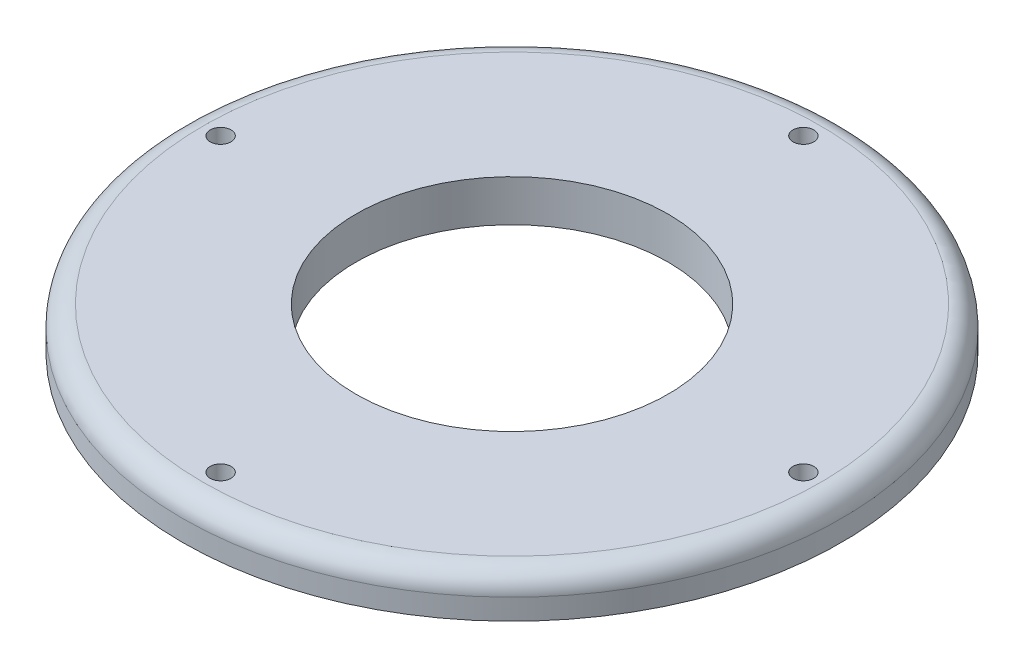
ISO-10303-21;
HEADER;
FILE_DESCRIPTION(('STEP AP214'),'2;1');
FILE_NAME('part.step','',(''),(''),'','','');
FILE_SCHEMA(('AUTOMOTIVE_DESIGN { 1 0 10303 214 1 1 1 1 }'));
ENDSEC;
DATA;
#1=APPLICATION_CONTEXT('core data for automotive mechanical design processes');
#2=APPLICATION_PROTOCOL_DEFINITION('international standard','automotive_design',2000,#1);
#3=PRODUCT_CONTEXT('',#1,'mechanical');
#4=PRODUCT('Part','Part','',(#3));
#5=PRODUCT_RELATED_PRODUCT_CATEGORY('part','',(#4));
#6=PRODUCT_DEFINITION_FORMATION('','',#4);
#7=PRODUCT_DEFINITION_CONTEXT('part definition',#1,'design');
#8=PRODUCT_DEFINITION('design','',#6,#7);
#9=PRODUCT_DEFINITION_SHAPE('','',#8);
#10=(LENGTH_UNIT() NAMED_UNIT(*) SI_UNIT(.MILLI.,.METRE.));
#11=(NAMED_UNIT(*) PLANE_ANGLE_UNIT() SI_UNIT($,.RADIAN.));
#12=(NAMED_UNIT(*) SI_UNIT($,.STERADIAN.) SOLID_ANGLE_UNIT());
#13=UNCERTAINTY_MEASURE_WITH_UNIT(LENGTH_MEASURE(1.E-05),#10,'distance_accuracy_value','');
#14=(GEOMETRIC_REPRESENTATION_CONTEXT(3) GLOBAL_UNCERTAINTY_ASSIGNED_CONTEXT((#13)) GLOBAL_UNIT_ASSIGNED_CONTEXT((#10,
#11,#12)) REPRESENTATION_CONTEXT('',''));
#15=CARTESIAN_POINT('',(0.,0.,0.));
#16=DIRECTION('',(0.,0.,1.));
#17=DIRECTION('',(1.,0.,0.));
#18=AXIS2_PLACEMENT_3D('',#15,#16,#17);
#19=CARTESIAN_POINT('',(0.,6.,0.));
#20=DIRECTION('',(0.,-1.,0.));
#21=DIRECTION('',(0.,0.,-1.));
#22=AXIS2_PLACEMENT_3D('',#19,#20,#21);
#23=CYLINDRICAL_SURFACE('',#22,47.5);
#24=CARTESIAN_POINT('',(0.,3.,0.));
#25=DIRECTION('',(0.,1.,0.));
#26=DIRECTION('',(0.,0.,1.));
#27=AXIS2_PLACEMENT_3D('',#24,#25,#26);
#28=CIRCLE('',#27,47.5);
#29=CARTESIAN_POINT('',(0.,3.,47.5));
#30=VERTEX_POINT('',#29);
#31=EDGE_CURVE('E10',#30,#30,#28,.F.);
#32=ORIENTED_EDGE('',*,*,#31,.T.);
#33=EDGE_LOOP('',(#32));
#34=FACE_BOUND('',#33,.T.);
#35=CARTESIAN_POINT('',(0.,0.,0.));
#36=DIRECTION('',(0.,1.,0.));
#37=DIRECTION('',(0.,0.,1.));
#38=AXIS2_PLACEMENT_3D('',#35,#36,#37);
#39=CIRCLE('',#38,47.5);
#40=CARTESIAN_POINT('',(0.,0.,47.5));
#41=VERTEX_POINT('',#40);
#42=EDGE_CURVE('E50',#41,#41,#39,.T.);
#43=ORIENTED_EDGE('',*,*,#42,.T.);
#44=EDGE_LOOP('',(#43));
#45=FACE_BOUND('',#44,.T.);
#46=ADVANCED_FACE('F37',(#34,#45),#23,.T.);
#47=CARTESIAN_POINT('',(0.,6.,0.));
#48=DIRECTION('',(0.,1.,0.));
#49=DIRECTION('',(0.,0.,1.));
#50=AXIS2_PLACEMENT_3D('',#47,#48,#49);
#51=PLANE('',#50);
#52=CARTESIAN_POINT('',(0.,6.,0.));
#53=DIRECTION('',(0.,1.,0.));
#54=DIRECTION('',(0.,0.,1.));
#55=AXIS2_PLACEMENT_3D('',#52,#53,#54);
#56=CIRCLE('',#55,44.5);
#57=CARTESIAN_POINT('',(0.,6.,44.5));
#58=VERTEX_POINT('',#57);
#59=EDGE_CURVE('E45',#58,#58,#56,.T.);
#60=ORIENTED_EDGE('',*,*,#59,.T.);
#61=EDGE_LOOP('',(#60));
#62=FACE_BOUND('',#61,.T.);
#63=CARTESIAN_POINT('',(0.,6.,0.));
#64=DIRECTION('',(0.,1.,0.));
#65=DIRECTION('',(0.,0.,1.));
#66=AXIS2_PLACEMENT_3D('',#63,#64,#65);
#67=CIRCLE('',#66,22.5);
#68=CARTESIAN_POINT('',(0.,6.,22.5));
#69=VERTEX_POINT('',#68);
#70=EDGE_CURVE('E90',#69,#69,#67,.T.);
#71=ORIENTED_EDGE('',*,*,#70,.F.);
#72=EDGE_LOOP('',(#71));
#73=FACE_BOUND('',#72,.T.);
#74=CARTESIAN_POINT('',(0.,6.,-42.));
#75=DIRECTION('',(0.,1.,0.));
#76=DIRECTION('',(0.,0.,1.));
#77=AXIS2_PLACEMENT_3D('',#74,#75,#76);
#78=CIRCLE('',#77,1.5);
#79=CARTESIAN_POINT('',(0.,6.,-40.5));
#80=VERTEX_POINT('',#79);
#81=EDGE_CURVE('E83',#80,#80,#78,.T.);
#82=ORIENTED_EDGE('',*,*,#81,.F.);
#83=EDGE_LOOP('',(#82));
#84=FACE_BOUND('',#83,.T.);
#85=CARTESIAN_POINT('',(42.0000000000012,6.,-1.18599652124234E-12));
#86=DIRECTION('',(0.,1.,0.));
#87=DIRECTION('',(0.,0.,1.));
#88=AXIS2_PLACEMENT_3D('',#85,#86,#87);
#89=CIRCLE('',#88,1.5);
#90=CARTESIAN_POINT('',(42.0000000000012,6.,1.49999999999882));
#91=VERTEX_POINT('',#90);
#92=EDGE_CURVE('E75',#91,#91,#89,.T.);
#93=ORIENTED_EDGE('',*,*,#92,.F.);
#94=EDGE_LOOP('',(#93));
#95=FACE_BOUND('',#94,.T.);
#96=CARTESIAN_POINT('',(2.37199304248468E-12,6.,42.));
#97=DIRECTION('',(0.,1.,0.));
#98=DIRECTION('',(0.,0.,1.));
#99=AXIS2_PLACEMENT_3D('',#96,#97,#98);
#100=CIRCLE('',#99,1.5);
#101=CARTESIAN_POINT('',(2.37199304248468E-12,6.,43.5));
#102=VERTEX_POINT('',#101);
#103=EDGE_CURVE('E67',#102,#102,#100,.T.);
#104=ORIENTED_EDGE('',*,*,#103,.F.);
#105=EDGE_LOOP('',(#104));
#106=FACE_BOUND('',#105,.T.);
#107=CARTESIAN_POINT('',(-41.9999999999988,6.,1.19114003779876E-12));
#108=DIRECTION('',(0.,1.,0.));
#109=DIRECTION('',(0.,0.,1.));
#110=AXIS2_PLACEMENT_3D('',#107,#108,#109);
#111=CIRCLE('',#110,1.5);
#112=CARTESIAN_POINT('',(-41.9999999999988,6.,1.5000000000012));
#113=VERTEX_POINT('',#112);
#114=EDGE_CURVE('E58',#113,#113,#111,.T.);
#115=ORIENTED_EDGE('',*,*,#114,.F.);
#116=EDGE_LOOP('',(#115));
#117=FACE_BOUND('',#116,.T.);
#118=ADVANCED_FACE('F108',(#62,#73,#84,#95,#106,#117),#51,.T.);
#119=CARTESIAN_POINT('',(0.,0.,0.));
#120=DIRECTION('',(0.,1.,0.));
#121=DIRECTION('',(0.,0.,1.));
#122=AXIS2_PLACEMENT_3D('',#119,#120,#121);
#123=PLANE('',#122);
#124=CARTESIAN_POINT('',(0.,0.,0.));
#125=DIRECTION('',(0.,1.,0.));
#126=DIRECTION('',(0.,0.,1.));
#127=AXIS2_PLACEMENT_3D('',#124,#125,#126);
#128=CIRCLE('',#127,22.5);
#129=CARTESIAN_POINT('',(0.,0.,22.5));
#130=VERTEX_POINT('',#129);
#131=EDGE_CURVE('E63',#130,#130,#128,.T.);
#132=ORIENTED_EDGE('',*,*,#131,.T.);
#133=EDGE_LOOP('',(#132));
#134=FACE_BOUND('',#133,.T.);
#135=CARTESIAN_POINT('',(0.,0.,-42.));
#136=DIRECTION('',(0.,1.,0.));
#137=DIRECTION('',(0.,0.,1.));
#138=AXIS2_PLACEMENT_3D('',#135,#136,#137);
#139=CIRCLE('',#138,1.5);
#140=CARTESIAN_POINT('',(0.,0.,-40.5));
#141=VERTEX_POINT('',#140);
#142=EDGE_CURVE('E55',#141,#141,#139,.T.);
#143=ORIENTED_EDGE('',*,*,#142,.T.);
#144=EDGE_LOOP('',(#143));
#145=FACE_BOUND('',#144,.T.);
#146=CARTESIAN_POINT('',(42.0000000000012,0.,-1.18599652124234E-12));
#147=DIRECTION('',(0.,1.,0.));
#148=DIRECTION('',(0.,0.,1.));
#149=AXIS2_PLACEMENT_3D('',#146,#147,#148);
#150=CIRCLE('',#149,1.5);
#151=CARTESIAN_POINT('',(42.0000000000012,0.,1.49999999999882));
#152=VERTEX_POINT('',#151);
#153=EDGE_CURVE('E79',#152,#152,#150,.T.);
#154=ORIENTED_EDGE('',*,*,#153,.T.);
#155=EDGE_LOOP('',(#154));
#156=FACE_BOUND('',#155,.T.);
#157=CARTESIAN_POINT('',(2.37199304248468E-12,0.,42.));
#158=DIRECTION('',(0.,1.,0.));
#159=DIRECTION('',(0.,0.,1.));
#160=AXIS2_PLACEMENT_3D('',#157,#158,#159);
#161=CIRCLE('',#160,1.5);
#162=CARTESIAN_POINT('',(2.37199304248468E-12,0.,43.5));
#163=VERTEX_POINT('',#162);
#164=EDGE_CURVE('E71',#163,#163,#161,.T.);
#165=ORIENTED_EDGE('',*,*,#164,.T.);
#166=EDGE_LOOP('',(#165));
#167=FACE_BOUND('',#166,.T.);
#168=CARTESIAN_POINT('',(-41.9999999999988,0.,1.19114003779876E-12));
#169=DIRECTION('',(0.,1.,0.));
#170=DIRECTION('',(0.,0.,1.));
#171=AXIS2_PLACEMENT_3D('',#168,#169,#170);
#172=CIRCLE('',#171,1.5);
#173=CARTESIAN_POINT('',(-41.9999999999988,0.,1.5000000000012));
#174=VERTEX_POINT('',#173);
#175=EDGE_CURVE('E62',#174,#174,#172,.T.);
#176=ORIENTED_EDGE('',*,*,#175,.T.);
#177=EDGE_LOOP('',(#176));
#178=FACE_BOUND('',#177,.T.);
#179=ORIENTED_EDGE('',*,*,#42,.F.);
#180=EDGE_LOOP('',(#179));
#181=FACE_BOUND('',#180,.T.);
#182=ADVANCED_FACE('F98',(#134,#145,#156,#167,#178,#181),#123,.F.);
#183=CARTESIAN_POINT('',(-41.9999999999988,0.,1.19114003779876E-12));
#184=DIRECTION('',(0.,1.,0.));
#185=DIRECTION('',(0.,0.,1.));
#186=AXIS2_PLACEMENT_3D('',#183,#184,#185);
#187=CYLINDRICAL_SURFACE('',#186,1.5);
#188=ORIENTED_EDGE('',*,*,#175,.F.);
#189=EDGE_LOOP('',(#188));
#190=FACE_BOUND('',#189,.T.);
#191=ORIENTED_EDGE('',*,*,#114,.T.);
#192=EDGE_LOOP('',(#191));
#193=FACE_BOUND('',#192,.T.);
#194=ADVANCED_FACE('F120',(#190,#193),#187,.F.);
#195=CARTESIAN_POINT('',(2.37199304248468E-12,0.,42.));
#196=DIRECTION('',(0.,1.,0.));
#197=DIRECTION('',(0.,0.,1.));
#198=AXIS2_PLACEMENT_3D('',#195,#196,#197);
#199=CYLINDRICAL_SURFACE('',#198,1.5);
#200=ORIENTED_EDGE('',*,*,#164,.F.);
#201=EDGE_LOOP('',(#200));
#202=FACE_BOUND('',#201,.T.);
#203=ORIENTED_EDGE('',*,*,#103,.T.);
#204=EDGE_LOOP('',(#203));
#205=FACE_BOUND('',#204,.T.);
#206=ADVANCED_FACE('F122',(#202,#205),#199,.F.);
#207=CARTESIAN_POINT('',(42.0000000000012,0.,-1.18599652124234E-12));
#208=DIRECTION('',(0.,1.,0.));
#209=DIRECTION('',(0.,0.,1.));
#210=AXIS2_PLACEMENT_3D('',#207,#208,#209);
#211=CYLINDRICAL_SURFACE('',#210,1.5);
#212=ORIENTED_EDGE('',*,*,#153,.F.);
#213=EDGE_LOOP('',(#212));
#214=FACE_BOUND('',#213,.T.);
#215=ORIENTED_EDGE('',*,*,#92,.T.);
#216=EDGE_LOOP('',(#215));
#217=FACE_BOUND('',#216,.T.);
#218=ADVANCED_FACE('F129',(#214,#217),#211,.F.);
#219=CARTESIAN_POINT('',(0.,0.,-42.));
#220=DIRECTION('',(0.,1.,0.));
#221=DIRECTION('',(0.,0.,1.));
#222=AXIS2_PLACEMENT_3D('',#219,#220,#221);
#223=CYLINDRICAL_SURFACE('',#222,1.5);
#224=ORIENTED_EDGE('',*,*,#142,.F.);
#225=EDGE_LOOP('',(#224));
#226=FACE_BOUND('',#225,.T.);
#227=ORIENTED_EDGE('',*,*,#81,.T.);
#228=EDGE_LOOP('',(#227));
#229=FACE_BOUND('',#228,.T.);
#230=ADVANCED_FACE('F104',(#226,#229),#223,.F.);
#231=CARTESIAN_POINT('',(0.,0.,0.));
#232=DIRECTION('',(0.,1.,0.));
#233=DIRECTION('',(0.,0.,1.));
#234=AXIS2_PLACEMENT_3D('',#231,#232,#233);
#235=CYLINDRICAL_SURFACE('',#234,22.5);
#236=ORIENTED_EDGE('',*,*,#131,.F.);
#237=EDGE_LOOP('',(#236));
#238=FACE_BOUND('',#237,.T.);
#239=ORIENTED_EDGE('',*,*,#70,.T.);
#240=EDGE_LOOP('',(#239));
#241=FACE_BOUND('',#240,.T.);
#242=ADVANCED_FACE('F101',(#238,#241),#235,.F.);
#243=CARTESIAN_POINT('',(0.,3.,0.));
#244=DIRECTION('',(0.,1.,0.));
#245=DIRECTION('',(0.,0.,1.));
#246=AXIS2_PLACEMENT_3D('',#243,#244,#245);
#247=TOROIDAL_SURFACE('',#246,44.5,3.);
#248=ORIENTED_EDGE('',*,*,#31,.F.);
#249=EDGE_LOOP('',(#248));
#250=FACE_BOUND('',#249,.T.);
#251=ORIENTED_EDGE('',*,*,#59,.F.);
#252=EDGE_LOOP('',(#251));
#253=FACE_BOUND('',#252,.T.);
#254=ADVANCED_FACE('F39',(#250,#253),#247,.T.);
#255=CLOSED_SHELL('',(#46,#118,#182,#194,#206,#218,#230,#242,#254));
#256=MANIFOLD_SOLID_BREP('B2',#255);
#257=ADVANCED_BREP_SHAPE_REPRESENTATION('',(#18,#256),#14);
#258=SHAPE_DEFINITION_REPRESENTATION(#9,#257);
ENDSEC;
END-ISO-10303-21;
